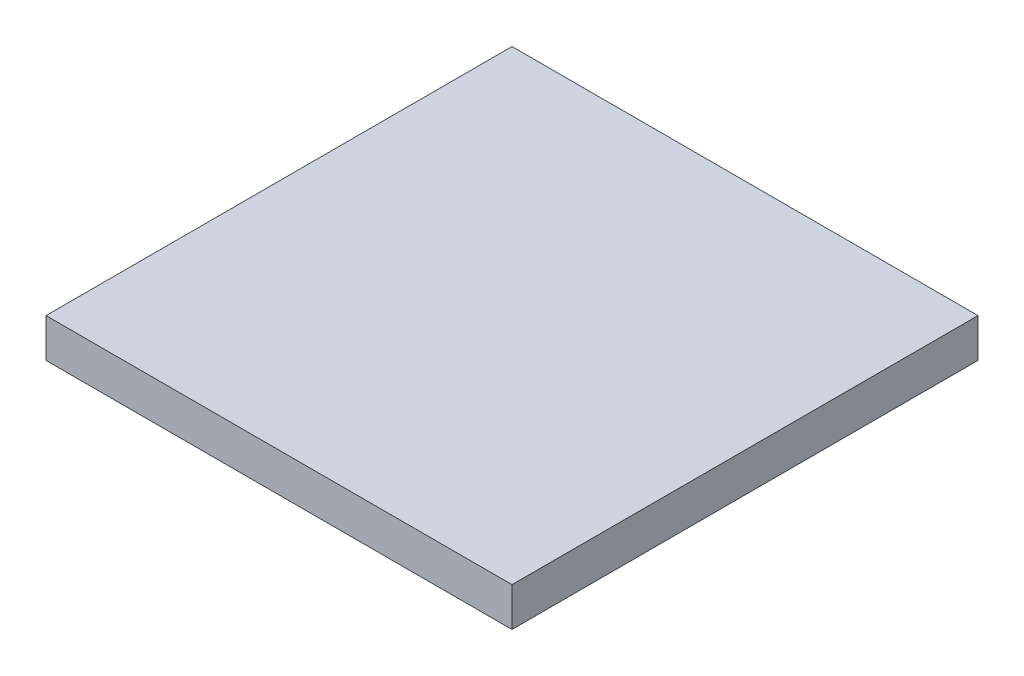
ISO-10303-21;
HEADER;
FILE_DESCRIPTION(('STEP AP214'),'2;1');
FILE_NAME('part.step','',(''),(''),'','','');
FILE_SCHEMA(('AUTOMOTIVE_DESIGN { 1 0 10303 214 1 1 1 1 }'));
ENDSEC;
DATA;
#1=APPLICATION_CONTEXT('core data for automotive mechanical design processes');
#2=APPLICATION_PROTOCOL_DEFINITION('international standard','automotive_design',2000,#1);
#3=PRODUCT_CONTEXT('',#1,'mechanical');
#4=PRODUCT('Part','Part','',(#3));
#5=PRODUCT_RELATED_PRODUCT_CATEGORY('part','',(#4));
#6=PRODUCT_DEFINITION_FORMATION('','',#4);
#7=PRODUCT_DEFINITION_CONTEXT('part definition',#1,'design');
#8=PRODUCT_DEFINITION('design','',#6,#7);
#9=PRODUCT_DEFINITION_SHAPE('','',#8);
#10=(LENGTH_UNIT() NAMED_UNIT(*) SI_UNIT(.MILLI.,.METRE.));
#11=(NAMED_UNIT(*) PLANE_ANGLE_UNIT() SI_UNIT($,.RADIAN.));
#12=(NAMED_UNIT(*) SI_UNIT($,.STERADIAN.) SOLID_ANGLE_UNIT());
#13=UNCERTAINTY_MEASURE_WITH_UNIT(LENGTH_MEASURE(1.E-05),#10,'distance_accuracy_value','');
#14=(GEOMETRIC_REPRESENTATION_CONTEXT(3) GLOBAL_UNCERTAINTY_ASSIGNED_CONTEXT((#13)) GLOBAL_UNIT_ASSIGNED_CONTEXT((#10,
#11,#12)) REPRESENTATION_CONTEXT('',''));
#15=CARTESIAN_POINT('',(0.,0.,0.));
#16=DIRECTION('',(0.,0.,1.));
#17=DIRECTION('',(1.,0.,0.));
#18=AXIS2_PLACEMENT_3D('',#15,#16,#17);
#19=CARTESIAN_POINT('',(-2.6638595554184,10.,149.689917766277));
#20=DIRECTION('',(1.,0.,0.));
#21=DIRECTION('',(0.,0.,-1.));
#22=AXIS2_PLACEMENT_3D('',#19,#20,#21);
#23=PLANE('',#22);
#24=DIRECTION('',(0.,0.,1.));
#25=VECTOR('',#24,1.);
#26=CARTESIAN_POINT('',(-2.6638595554184,0.,149.689917766277));
#27=LINE('',#26,#25);
#28=CARTESIAN_POINT('',(-2.6638595554184,0.,29.6899177662766));
#29=VERTEX_POINT('',#28);
#30=CARTESIAN_POINT('',(-2.6638595554184,0.,149.689917766277));
#31=VERTEX_POINT('',#30);
#32=EDGE_CURVE('E100',#29,#31,#27,.T.);
#33=ORIENTED_EDGE('',*,*,#32,.T.);
#34=DIRECTION('',(0.,-1.,0.));
#35=VECTOR('',#34,1.);
#36=CARTESIAN_POINT('',(-2.6638595554184,10.,149.689917766277));
#37=LINE('',#36,#35);
#38=CARTESIAN_POINT('',(-2.6638595554184,10.,149.689917766277));
#39=VERTEX_POINT('',#38);
#40=EDGE_CURVE('E11',#39,#31,#37,.T.);
#41=ORIENTED_EDGE('',*,*,#40,.F.);
#42=DIRECTION('',(0.,0.,1.));
#43=VECTOR('',#42,1.);
#44=CARTESIAN_POINT('',(-2.6638595554184,10.,149.689917766277));
#45=LINE('',#44,#43);
#46=CARTESIAN_POINT('',(-2.6638595554184,10.,29.6899177662766));
#47=VERTEX_POINT('',#46);
#48=EDGE_CURVE('E88',#47,#39,#45,.T.);
#49=ORIENTED_EDGE('',*,*,#48,.F.);
#50=DIRECTION('',(0.,-1.,0.));
#51=VECTOR('',#50,1.);
#52=CARTESIAN_POINT('',(-2.6638595554184,10.,29.6899177662766));
#53=LINE('',#52,#51);
#54=EDGE_CURVE('E96',#47,#29,#53,.T.);
#55=ORIENTED_EDGE('',*,*,#54,.T.);
#56=EDGE_LOOP('',(#33,#41,#49,#55));
#57=FACE_BOUND('',#56,.T.);
#58=ADVANCED_FACE('F37',(#57),#23,.F.);
#59=CARTESIAN_POINT('',(117.336140444582,10.,149.689917766277));
#60=DIRECTION('',(0.,0.,-1.));
#61=DIRECTION('',(-1.,0.,0.));
#62=AXIS2_PLACEMENT_3D('',#59,#60,#61);
#63=PLANE('',#62);
#64=DIRECTION('',(1.,0.,0.));
#65=VECTOR('',#64,1.);
#66=CARTESIAN_POINT('',(117.336140444582,0.,149.689917766277));
#67=LINE('',#66,#65);
#68=CARTESIAN_POINT('',(117.336140444582,0.,149.689917766277));
#69=VERTEX_POINT('',#68);
#70=EDGE_CURVE('E92',#31,#69,#67,.T.);
#71=ORIENTED_EDGE('',*,*,#70,.T.);
#72=DIRECTION('',(0.,-1.,0.));
#73=VECTOR('',#72,1.);
#74=CARTESIAN_POINT('',(117.336140444582,10.,149.689917766277));
#75=LINE('',#74,#73);
#76=CARTESIAN_POINT('',(117.336140444582,10.,149.689917766277));
#77=VERTEX_POINT('',#76);
#78=EDGE_CURVE('E45',#77,#69,#75,.T.);
#79=ORIENTED_EDGE('',*,*,#78,.F.);
#80=DIRECTION('',(1.,0.,0.));
#81=VECTOR('',#80,1.);
#82=CARTESIAN_POINT('',(117.336140444582,10.,149.689917766277));
#83=LINE('',#82,#81);
#84=EDGE_CURVE('E83',#39,#77,#83,.T.);
#85=ORIENTED_EDGE('',*,*,#84,.F.);
#86=ORIENTED_EDGE('',*,*,#40,.T.);
#87=EDGE_LOOP('',(#71,#79,#85,#86));
#88=FACE_BOUND('',#87,.T.);
#89=ADVANCED_FACE('F91',(#88),#63,.F.);
#90=CARTESIAN_POINT('',(117.336140444582,10.,29.6899177662766));
#91=DIRECTION('',(-1.,0.,0.));
#92=DIRECTION('',(0.,0.,1.));
#93=AXIS2_PLACEMENT_3D('',#90,#91,#92);
#94=PLANE('',#93);
#95=DIRECTION('',(0.,0.,-1.));
#96=VECTOR('',#95,1.);
#97=CARTESIAN_POINT('',(117.336140444582,0.,29.6899177662766));
#98=LINE('',#97,#96);
#99=CARTESIAN_POINT('',(117.336140444582,0.,29.6899177662766));
#100=VERTEX_POINT('',#99);
#101=EDGE_CURVE('E70',#69,#100,#98,.T.);
#102=ORIENTED_EDGE('',*,*,#101,.T.);
#103=DIRECTION('',(0.,-1.,0.));
#104=VECTOR('',#103,1.);
#105=CARTESIAN_POINT('',(117.336140444582,10.,29.6899177662766));
#106=LINE('',#105,#104);
#107=CARTESIAN_POINT('',(117.336140444582,10.,29.6899177662766));
#108=VERTEX_POINT('',#107);
#109=EDGE_CURVE('E93',#108,#100,#106,.T.);
#110=ORIENTED_EDGE('',*,*,#109,.F.);
#111=DIRECTION('',(0.,0.,-1.));
#112=VECTOR('',#111,1.);
#113=CARTESIAN_POINT('',(117.336140444582,10.,29.6899177662766));
#114=LINE('',#113,#112);
#115=EDGE_CURVE('E86',#77,#108,#114,.T.);
#116=ORIENTED_EDGE('',*,*,#115,.F.);
#117=ORIENTED_EDGE('',*,*,#78,.T.);
#118=EDGE_LOOP('',(#102,#110,#116,#117));
#119=FACE_BOUND('',#118,.T.);
#120=ADVANCED_FACE('F94',(#119),#94,.F.);
#121=CARTESIAN_POINT('',(-2.6638595554184,10.,29.6899177662766));
#122=DIRECTION('',(0.,0.,1.));
#123=DIRECTION('',(1.,0.,0.));
#124=AXIS2_PLACEMENT_3D('',#121,#122,#123);
#125=PLANE('',#124);
#126=DIRECTION('',(-1.,0.,0.));
#127=VECTOR('',#126,1.);
#128=CARTESIAN_POINT('',(-2.6638595554184,0.,29.6899177662766));
#129=LINE('',#128,#127);
#130=EDGE_CURVE('E76',#100,#29,#129,.T.);
#131=ORIENTED_EDGE('',*,*,#130,.T.);
#132=ORIENTED_EDGE('',*,*,#54,.F.);
#133=DIRECTION('',(-1.,0.,0.));
#134=VECTOR('',#133,1.);
#135=CARTESIAN_POINT('',(-2.6638595554184,10.,29.6899177662766));
#136=LINE('',#135,#134);
#137=EDGE_CURVE('E53',#108,#47,#136,.T.);
#138=ORIENTED_EDGE('',*,*,#137,.F.);
#139=ORIENTED_EDGE('',*,*,#109,.T.);
#140=EDGE_LOOP('',(#131,#132,#138,#139));
#141=FACE_BOUND('',#140,.T.);
#142=ADVANCED_FACE('F107',(#141),#125,.F.);
#143=CARTESIAN_POINT('',(0.,10.,0.));
#144=DIRECTION('',(0.,-1.,0.));
#145=DIRECTION('',(0.,0.,-1.));
#146=AXIS2_PLACEMENT_3D('',#143,#144,#145);
#147=PLANE('',#146);
#148=ORIENTED_EDGE('',*,*,#48,.T.);
#149=ORIENTED_EDGE('',*,*,#84,.T.);
#150=ORIENTED_EDGE('',*,*,#115,.T.);
#151=ORIENTED_EDGE('',*,*,#137,.T.);
#152=EDGE_LOOP('',(#148,#149,#150,#151));
#153=FACE_BOUND('',#152,.T.);
#154=ADVANCED_FACE('F84',(#153),#147,.F.);
#155=CARTESIAN_POINT('',(0.,0.,0.));
#156=DIRECTION('',(0.,-1.,0.));
#157=DIRECTION('',(0.,0.,-1.));
#158=AXIS2_PLACEMENT_3D('',#155,#156,#157);
#159=PLANE('',#158);
#160=ORIENTED_EDGE('',*,*,#32,.F.);
#161=ORIENTED_EDGE('',*,*,#130,.F.);
#162=ORIENTED_EDGE('',*,*,#101,.F.);
#163=ORIENTED_EDGE('',*,*,#70,.F.);
#164=EDGE_LOOP('',(#160,#161,#162,#163));
#165=FACE_BOUND('',#164,.T.);
#166=ADVANCED_FACE('F110',(#165),#159,.T.);
#167=CLOSED_SHELL('',(#58,#89,#120,#142,#154,#166));
#168=MANIFOLD_SOLID_BREP('B2',#167);
#169=ADVANCED_BREP_SHAPE_REPRESENTATION('',(#18,#168),#14);
#170=SHAPE_DEFINITION_REPRESENTATION(#9,#169);
ENDSEC;
END-ISO-10303-21;
